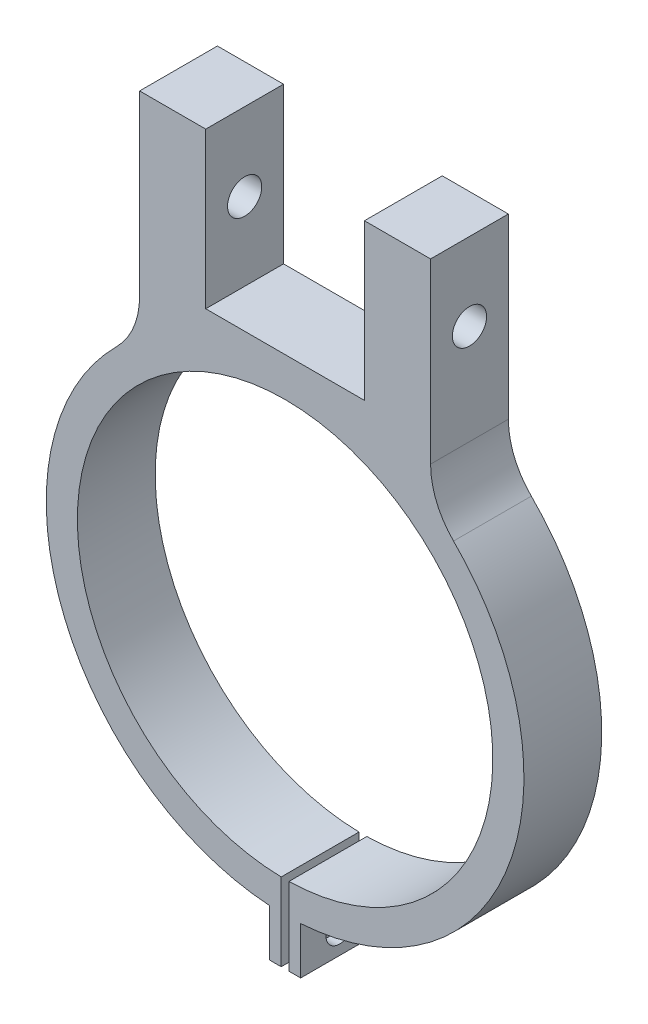
ISO-10303-21;
HEADER;
FILE_DESCRIPTION(('STEP AP214'),'2;1');
FILE_NAME('part.step','',(''),(''),'','','');
FILE_SCHEMA(('AUTOMOTIVE_DESIGN { 1 0 10303 214 1 1 1 1 }'));
ENDSEC;
DATA;
#1=APPLICATION_CONTEXT('core data for automotive mechanical design processes');
#2=APPLICATION_PROTOCOL_DEFINITION('international standard','automotive_design',2000,#1);
#3=PRODUCT_CONTEXT('',#1,'mechanical');
#4=PRODUCT('Part','Part','',(#3));
#5=PRODUCT_RELATED_PRODUCT_CATEGORY('part','',(#4));
#6=PRODUCT_DEFINITION_FORMATION('','',#4);
#7=PRODUCT_DEFINITION_CONTEXT('part definition',#1,'design');
#8=PRODUCT_DEFINITION('design','',#6,#7);
#9=PRODUCT_DEFINITION_SHAPE('','',#8);
#10=(LENGTH_UNIT() NAMED_UNIT(*) SI_UNIT(.MILLI.,.METRE.));
#11=(NAMED_UNIT(*) PLANE_ANGLE_UNIT() SI_UNIT($,.RADIAN.));
#12=(NAMED_UNIT(*) SI_UNIT($,.STERADIAN.) SOLID_ANGLE_UNIT());
#13=UNCERTAINTY_MEASURE_WITH_UNIT(LENGTH_MEASURE(1.E-05),#10,'distance_accuracy_value','');
#14=(GEOMETRIC_REPRESENTATION_CONTEXT(3) GLOBAL_UNCERTAINTY_ASSIGNED_CONTEXT((#13)) GLOBAL_UNIT_ASSIGNED_CONTEXT((#10,
#11,#12)) REPRESENTATION_CONTEXT('',''));
#15=CARTESIAN_POINT('',(0.,0.,0.));
#16=DIRECTION('',(0.,0.,1.));
#17=DIRECTION('',(1.,0.,0.));
#18=AXIS2_PLACEMENT_3D('',#15,#16,#17);
#19=CARTESIAN_POINT('',(2.,-36.6959280687195,10.));
#20=DIRECTION('',(-1.,0.,0.));
#21=DIRECTION('',(0.,-1.,0.));
#22=AXIS2_PLACEMENT_3D('',#19,#20,#21);
#23=PLANE('',#22);
#24=CARTESIAN_POINT('',(2.00000000000001,-33.6653561100363,5.));
#25=DIRECTION('',(-1.,0.,0.));
#26=DIRECTION('',(0.,-1.,0.));
#27=AXIS2_PLACEMENT_3D('',#24,#25,#26);
#28=CIRCLE('',#27,1.75);
#29=CARTESIAN_POINT('',(2.00000000000001,-35.4153561100363,5.));
#30=VERTEX_POINT('',#29);
#31=EDGE_CURVE('E227',#30,#30,#28,.T.);
#32=ORIENTED_EDGE('',*,*,#31,.T.);
#33=EDGE_LOOP('',(#32));
#34=FACE_BOUND('',#33,.T.);
#35=DIRECTION('',(0.,1.,0.));
#36=VECTOR('',#35,1.);
#37=CARTESIAN_POINT('',(2.,-36.6959280687195,0.));
#38=LINE('',#37,#36);
#39=CARTESIAN_POINT('',(2.,-36.6959280687195,0.));
#40=VERTEX_POINT('',#39);
#41=CARTESIAN_POINT('',(2.,-30.6347841513532,0.));
#42=VERTEX_POINT('',#41);
#43=EDGE_CURVE('E185',#40,#42,#38,.T.);
#44=ORIENTED_EDGE('',*,*,#43,.T.);
#45=DIRECTION('',(0.,0.,-1.));
#46=VECTOR('',#45,1.);
#47=CARTESIAN_POINT('',(2.,-30.6347841513532,10.));
#48=LINE('',#47,#46);
#49=CARTESIAN_POINT('',(2.,-30.6347841513532,10.));
#50=VERTEX_POINT('',#49);
#51=EDGE_CURVE('E166',#50,#42,#48,.T.);
#52=ORIENTED_EDGE('',*,*,#51,.F.);
#53=DIRECTION('',(0.,1.,0.));
#54=VECTOR('',#53,1.);
#55=CARTESIAN_POINT('',(2.,-36.6959280687195,10.));
#56=LINE('',#55,#54);
#57=CARTESIAN_POINT('',(2.,-36.6959280687195,10.));
#58=VERTEX_POINT('',#57);
#59=EDGE_CURVE('E173',#58,#50,#56,.T.);
#60=ORIENTED_EDGE('',*,*,#59,.F.);
#61=DIRECTION('',(0.,0.,-1.));
#62=VECTOR('',#61,1.);
#63=CARTESIAN_POINT('',(2.,-36.6959280687195,10.));
#64=LINE('',#63,#62);
#65=EDGE_CURVE('E257',#58,#40,#64,.T.);
#66=ORIENTED_EDGE('',*,*,#65,.T.);
#67=EDGE_LOOP('',(#44,#52,#60,#66));
#68=FACE_BOUND('',#67,.T.);
#69=ADVANCED_FACE('F36',(#34,#68),#23,.F.);
#70=CARTESIAN_POINT('',(0.,0.,10.));
#71=DIRECTION('',(0.,0.,-1.));
#72=DIRECTION('',(-1.,0.,0.));
#73=AXIS2_PLACEMENT_3D('',#70,#71,#72);
#74=CYLINDRICAL_SURFACE('',#73,30.7);
#75=CARTESIAN_POINT('',(0.,0.,0.));
#76=DIRECTION('',(0.,0.,1.));
#77=DIRECTION('',(1.,0.,0.));
#78=AXIS2_PLACEMENT_3D('',#75,#76,#77);
#79=CIRCLE('',#78,30.7);
#80=CARTESIAN_POINT('',(21.6484029484029,21.7677892718479,0.));
#81=VERTEX_POINT('',#80);
#82=EDGE_CURVE('E221',#42,#81,#79,.T.);
#83=ORIENTED_EDGE('',*,*,#82,.T.);
#84=DIRECTION('',(0.,0.,-1.));
#85=VECTOR('',#84,1.);
#86=CARTESIAN_POINT('',(21.6484029484029,21.7677892718479,10.));
#87=LINE('',#86,#85);
#88=CARTESIAN_POINT('',(21.6484029484029,21.7677892718479,10.));
#89=VERTEX_POINT('',#88);
#90=EDGE_CURVE('E169',#81,#89,#87,.F.);
#91=ORIENTED_EDGE('',*,*,#90,.T.);
#92=CARTESIAN_POINT('',(0.,0.,10.));
#93=DIRECTION('',(0.,0.,1.));
#94=DIRECTION('',(1.,0.,0.));
#95=AXIS2_PLACEMENT_3D('',#92,#93,#94);
#96=CIRCLE('',#95,30.7);
#97=EDGE_CURVE('E161',#50,#89,#96,.T.);
#98=ORIENTED_EDGE('',*,*,#97,.F.);
#99=ORIENTED_EDGE('',*,*,#51,.T.);
#100=EDGE_LOOP('',(#83,#91,#98,#99));
#101=FACE_BOUND('',#100,.T.);
#102=ADVANCED_FACE('F164',(#101),#74,.T.);
#103=CARTESIAN_POINT('',(18.7,51.7,10.));
#104=DIRECTION('',(-1.,0.,0.));
#105=DIRECTION('',(0.,0.,1.));
#106=AXIS2_PLACEMENT_3D('',#103,#104,#105);
#107=PLANE('',#106);
#108=CARTESIAN_POINT('',(18.7,41.7,5.));
#109=DIRECTION('',(-1.,0.,0.));
#110=DIRECTION('',(0.,0.,1.));
#111=AXIS2_PLACEMENT_3D('',#108,#109,#110);
#112=CIRCLE('',#111,2.2);
#113=CARTESIAN_POINT('',(18.7,41.7,7.2));
#114=VERTEX_POINT('',#113);
#115=EDGE_CURVE('E582',#114,#114,#112,.T.);
#116=ORIENTED_EDGE('',*,*,#115,.T.);
#117=EDGE_LOOP('',(#116));
#118=FACE_BOUND('',#117,.T.);
#119=DIRECTION('',(0.,1.,0.));
#120=VECTOR('',#119,1.);
#121=CARTESIAN_POINT('',(18.7,51.7,10.));
#122=LINE('',#121,#120);
#123=CARTESIAN_POINT('',(18.7,28.8582743766844,10.));
#124=VERTEX_POINT('',#123);
#125=CARTESIAN_POINT('',(18.7,51.7,10.));
#126=VERTEX_POINT('',#125);
#127=EDGE_CURVE('E172',#124,#126,#122,.T.);
#128=ORIENTED_EDGE('',*,*,#127,.F.);
#129=DIRECTION('',(0.,0.,1.));
#130=VECTOR('',#129,1.);
#131=CARTESIAN_POINT('',(18.7,28.8582743766844,0.));
#132=LINE('',#131,#130);
#133=CARTESIAN_POINT('',(18.7,28.8582743766844,0.));
#134=VERTEX_POINT('',#133);
#135=EDGE_CURVE('E186',#124,#134,#132,.F.);
#136=ORIENTED_EDGE('',*,*,#135,.T.);
#137=DIRECTION('',(0.,1.,0.));
#138=VECTOR('',#137,1.);
#139=CARTESIAN_POINT('',(18.7,51.7,0.));
#140=LINE('',#139,#138);
#141=CARTESIAN_POINT('',(18.7,51.7,0.));
#142=VERTEX_POINT('',#141);
#143=EDGE_CURVE('E223',#134,#142,#140,.T.);
#144=ORIENTED_EDGE('',*,*,#143,.T.);
#145=DIRECTION('',(0.,0.,-1.));
#146=VECTOR('',#145,1.);
#147=CARTESIAN_POINT('',(18.7,51.7,10.));
#148=LINE('',#147,#146);
#149=EDGE_CURVE('E187',#126,#142,#148,.T.);
#150=ORIENTED_EDGE('',*,*,#149,.F.);
#151=EDGE_LOOP('',(#128,#136,#144,#150));
#152=FACE_BOUND('',#151,.T.);
#153=ADVANCED_FACE('F214',(#118,#152),#107,.F.);
#154=CARTESIAN_POINT('',(10.2,51.7,10.));
#155=DIRECTION('',(0.,-1.,0.));
#156=DIRECTION('',(0.,0.,-1.));
#157=AXIS2_PLACEMENT_3D('',#154,#155,#156);
#158=PLANE('',#157);
#159=DIRECTION('',(-1.,0.,0.));
#160=VECTOR('',#159,1.);
#161=CARTESIAN_POINT('',(10.2,51.7,0.));
#162=LINE('',#161,#160);
#163=CARTESIAN_POINT('',(10.2,51.7,0.));
#164=VERTEX_POINT('',#163);
#165=EDGE_CURVE('E225',#142,#164,#162,.T.);
#166=ORIENTED_EDGE('',*,*,#165,.T.);
#167=DIRECTION('',(0.,0.,-1.));
#168=VECTOR('',#167,1.);
#169=CARTESIAN_POINT('',(10.2,51.7,10.));
#170=LINE('',#169,#168);
#171=CARTESIAN_POINT('',(10.2,51.7,10.));
#172=VERTEX_POINT('',#171);
#173=EDGE_CURVE('E192',#172,#164,#170,.T.);
#174=ORIENTED_EDGE('',*,*,#173,.F.);
#175=DIRECTION('',(-1.,0.,0.));
#176=VECTOR('',#175,1.);
#177=CARTESIAN_POINT('',(10.2,51.7,10.));
#178=LINE('',#177,#176);
#179=EDGE_CURVE('E217',#126,#172,#178,.T.);
#180=ORIENTED_EDGE('',*,*,#179,.F.);
#181=ORIENTED_EDGE('',*,*,#149,.T.);
#182=EDGE_LOOP('',(#166,#174,#180,#181));
#183=FACE_BOUND('',#182,.T.);
#184=ADVANCED_FACE('F501',(#183),#158,.F.);
#185=CARTESIAN_POINT('',(10.2,31.7,10.));
#186=DIRECTION('',(1.,0.,0.));
#187=DIRECTION('',(0.,0.,-1.));
#188=AXIS2_PLACEMENT_3D('',#185,#186,#187);
#189=PLANE('',#188);
#190=CARTESIAN_POINT('',(10.2,41.7,5.));
#191=DIRECTION('',(1.,0.,0.));
#192=DIRECTION('',(0.,0.,-1.));
#193=AXIS2_PLACEMENT_3D('',#190,#191,#192);
#194=CIRCLE('',#193,2.2);
#195=CARTESIAN_POINT('',(10.2,41.7,2.8));
#196=VERTEX_POINT('',#195);
#197=EDGE_CURVE('E585',#196,#196,#194,.T.);
#198=ORIENTED_EDGE('',*,*,#197,.T.);
#199=EDGE_LOOP('',(#198));
#200=FACE_BOUND('',#199,.T.);
#201=DIRECTION('',(0.,-1.,0.));
#202=VECTOR('',#201,1.);
#203=CARTESIAN_POINT('',(10.2,31.7,0.));
#204=LINE('',#203,#202);
#205=CARTESIAN_POINT('',(10.2,31.7,0.));
#206=VERTEX_POINT('',#205);
#207=EDGE_CURVE('E232',#164,#206,#204,.T.);
#208=ORIENTED_EDGE('',*,*,#207,.T.);
#209=DIRECTION('',(0.,0.,-1.));
#210=VECTOR('',#209,1.);
#211=CARTESIAN_POINT('',(10.2,31.7,10.));
#212=LINE('',#211,#210);
#213=CARTESIAN_POINT('',(10.2,31.7,10.));
#214=VERTEX_POINT('',#213);
#215=EDGE_CURVE('E286',#214,#206,#212,.T.);
#216=ORIENTED_EDGE('',*,*,#215,.F.);
#217=DIRECTION('',(0.,-1.,0.));
#218=VECTOR('',#217,1.);
#219=CARTESIAN_POINT('',(10.2,31.7,10.));
#220=LINE('',#219,#218);
#221=EDGE_CURVE('E295',#172,#214,#220,.T.);
#222=ORIENTED_EDGE('',*,*,#221,.F.);
#223=ORIENTED_EDGE('',*,*,#173,.T.);
#224=EDGE_LOOP('',(#208,#216,#222,#223));
#225=FACE_BOUND('',#224,.T.);
#226=ADVANCED_FACE('F293',(#200,#225),#189,.F.);
#227=CARTESIAN_POINT('',(-10.2,31.7,10.));
#228=DIRECTION('',(0.,-1.,0.));
#229=DIRECTION('',(0.,0.,-1.));
#230=AXIS2_PLACEMENT_3D('',#227,#228,#229);
#231=PLANE('',#230);
#232=DIRECTION('',(-1.,0.,0.));
#233=VECTOR('',#232,1.);
#234=CARTESIAN_POINT('',(-10.2,31.7,0.));
#235=LINE('',#234,#233);
#236=CARTESIAN_POINT('',(-10.2,31.7,0.));
#237=VERTEX_POINT('',#236);
#238=EDGE_CURVE('E234',#206,#237,#235,.T.);
#239=ORIENTED_EDGE('',*,*,#238,.T.);
#240=DIRECTION('',(0.,0.,-1.));
#241=VECTOR('',#240,1.);
#242=CARTESIAN_POINT('',(-10.2,31.7,10.));
#243=LINE('',#242,#241);
#244=CARTESIAN_POINT('',(-10.2,31.7,10.));
#245=VERTEX_POINT('',#244);
#246=EDGE_CURVE('E283',#245,#237,#243,.T.);
#247=ORIENTED_EDGE('',*,*,#246,.F.);
#248=DIRECTION('',(-1.,0.,0.));
#249=VECTOR('',#248,1.);
#250=CARTESIAN_POINT('',(-10.2,31.7,10.));
#251=LINE('',#250,#249);
#252=EDGE_CURVE('E311',#214,#245,#251,.T.);
#253=ORIENTED_EDGE('',*,*,#252,.F.);
#254=ORIENTED_EDGE('',*,*,#215,.T.);
#255=EDGE_LOOP('',(#239,#247,#253,#254));
#256=FACE_BOUND('',#255,.T.);
#257=ADVANCED_FACE('F302',(#256),#231,.F.);
#258=CARTESIAN_POINT('',(-10.2,31.7,10.));
#259=DIRECTION('',(-1.,0.,0.));
#260=DIRECTION('',(0.,0.,1.));
#261=AXIS2_PLACEMENT_3D('',#258,#259,#260);
#262=PLANE('',#261);
#263=CARTESIAN_POINT('',(-10.2,41.7,5.));
#264=DIRECTION('',(-1.,0.,0.));
#265=DIRECTION('',(0.,0.,1.));
#266=AXIS2_PLACEMENT_3D('',#263,#264,#265);
#267=CIRCLE('',#266,2.2);
#268=CARTESIAN_POINT('',(-10.2,41.7,7.2));
#269=VERTEX_POINT('',#268);
#270=EDGE_CURVE('E588',#269,#269,#267,.T.);
#271=ORIENTED_EDGE('',*,*,#270,.T.);
#272=EDGE_LOOP('',(#271));
#273=FACE_BOUND('',#272,.T.);
#274=DIRECTION('',(0.,1.,0.));
#275=VECTOR('',#274,1.);
#276=CARTESIAN_POINT('',(-10.2,31.7,0.));
#277=LINE('',#276,#275);
#278=CARTESIAN_POINT('',(-10.2,51.7,0.));
#279=VERTEX_POINT('',#278);
#280=EDGE_CURVE('E236',#237,#279,#277,.T.);
#281=ORIENTED_EDGE('',*,*,#280,.T.);
#282=DIRECTION('',(0.,0.,-1.));
#283=VECTOR('',#282,1.);
#284=CARTESIAN_POINT('',(-10.2,51.7,10.));
#285=LINE('',#284,#283);
#286=CARTESIAN_POINT('',(-10.2,51.7,10.));
#287=VERTEX_POINT('',#286);
#288=EDGE_CURVE('E280',#287,#279,#285,.T.);
#289=ORIENTED_EDGE('',*,*,#288,.F.);
#290=DIRECTION('',(0.,1.,0.));
#291=VECTOR('',#290,1.);
#292=CARTESIAN_POINT('',(-10.2,31.7,10.));
#293=LINE('',#292,#291);
#294=EDGE_CURVE('E308',#245,#287,#293,.T.);
#295=ORIENTED_EDGE('',*,*,#294,.F.);
#296=ORIENTED_EDGE('',*,*,#246,.T.);
#297=EDGE_LOOP('',(#281,#289,#295,#296));
#298=FACE_BOUND('',#297,.T.);
#299=ADVANCED_FACE('F306',(#273,#298),#262,.F.);
#300=CARTESIAN_POINT('',(-10.2,51.7,10.));
#301=DIRECTION('',(0.,-1.,0.));
#302=DIRECTION('',(0.,0.,-1.));
#303=AXIS2_PLACEMENT_3D('',#300,#301,#302);
#304=PLANE('',#303);
#305=DIRECTION('',(-1.,0.,0.));
#306=VECTOR('',#305,1.);
#307=CARTESIAN_POINT('',(-10.2,51.7,0.));
#308=LINE('',#307,#306);
#309=CARTESIAN_POINT('',(-18.7,51.7,0.));
#310=VERTEX_POINT('',#309);
#311=EDGE_CURVE('E238',#279,#310,#308,.T.);
#312=ORIENTED_EDGE('',*,*,#311,.T.);
#313=DIRECTION('',(0.,0.,-1.));
#314=VECTOR('',#313,1.);
#315=CARTESIAN_POINT('',(-18.7,51.7,10.));
#316=LINE('',#315,#314);
#317=CARTESIAN_POINT('',(-18.7,51.7,10.));
#318=VERTEX_POINT('',#317);
#319=EDGE_CURVE('E277',#318,#310,#316,.T.);
#320=ORIENTED_EDGE('',*,*,#319,.F.);
#321=DIRECTION('',(-1.,0.,0.));
#322=VECTOR('',#321,1.);
#323=CARTESIAN_POINT('',(-10.2,51.7,10.));
#324=LINE('',#323,#322);
#325=EDGE_CURVE('E310',#287,#318,#324,.T.);
#326=ORIENTED_EDGE('',*,*,#325,.F.);
#327=ORIENTED_EDGE('',*,*,#288,.T.);
#328=EDGE_LOOP('',(#312,#320,#326,#327));
#329=FACE_BOUND('',#328,.T.);
#330=ADVANCED_FACE('F366',(#329),#304,.F.);
#331=CARTESIAN_POINT('',(-18.7,51.7,10.));
#332=DIRECTION('',(1.,0.,0.));
#333=DIRECTION('',(0.,0.,-1.));
#334=AXIS2_PLACEMENT_3D('',#331,#332,#333);
#335=PLANE('',#334);
#336=CARTESIAN_POINT('',(-18.7,41.7,5.));
#337=DIRECTION('',(-1.,0.,0.));
#338=DIRECTION('',(0.,-1.,0.));
#339=AXIS2_PLACEMENT_3D('',#336,#337,#338);
#340=CIRCLE('',#339,2.2);
#341=CARTESIAN_POINT('',(-18.7,39.5,5.));
#342=VERTEX_POINT('',#341);
#343=EDGE_CURVE('E591',#342,#342,#340,.T.);
#344=ORIENTED_EDGE('',*,*,#343,.F.);
#345=EDGE_LOOP('',(#344));
#346=FACE_BOUND('',#345,.T.);
#347=DIRECTION('',(0.,-1.,0.));
#348=VECTOR('',#347,1.);
#349=CARTESIAN_POINT('',(-18.7,51.7,0.));
#350=LINE('',#349,#348);
#351=CARTESIAN_POINT('',(-18.7,28.8582743766844,0.));
#352=VERTEX_POINT('',#351);
#353=EDGE_CURVE('E240',#310,#352,#350,.T.);
#354=ORIENTED_EDGE('',*,*,#353,.T.);
#355=DIRECTION('',(0.,0.,1.));
#356=VECTOR('',#355,1.);
#357=CARTESIAN_POINT('',(-18.7,28.8582743766844,10.));
#358=LINE('',#357,#356);
#359=CARTESIAN_POINT('',(-18.7,28.8582743766844,10.));
#360=VERTEX_POINT('',#359);
#361=EDGE_CURVE('E51',#352,#360,#358,.T.);
#362=ORIENTED_EDGE('',*,*,#361,.T.);
#363=DIRECTION('',(0.,-1.,0.));
#364=VECTOR('',#363,1.);
#365=CARTESIAN_POINT('',(-18.7,51.7,10.));
#366=LINE('',#365,#364);
#367=EDGE_CURVE('E313',#318,#360,#366,.T.);
#368=ORIENTED_EDGE('',*,*,#367,.F.);
#369=ORIENTED_EDGE('',*,*,#319,.T.);
#370=EDGE_LOOP('',(#354,#362,#368,#369));
#371=FACE_BOUND('',#370,.T.);
#372=ADVANCED_FACE('F364',(#346,#371),#335,.F.);
#373=CARTESIAN_POINT('',(0.,0.,10.));
#374=DIRECTION('',(0.,0.,-1.));
#375=DIRECTION('',(-1.,0.,0.));
#376=AXIS2_PLACEMENT_3D('',#373,#374,#375);
#377=CYLINDRICAL_SURFACE('',#376,30.7);
#378=CARTESIAN_POINT('',(0.,0.,10.));
#379=DIRECTION('',(0.,0.,1.));
#380=DIRECTION('',(1.,0.,0.));
#381=AXIS2_PLACEMENT_3D('',#378,#379,#380);
#382=CIRCLE('',#381,30.7);
#383=CARTESIAN_POINT('',(-21.6484029484029,21.7677892718479,10.));
#384=VERTEX_POINT('',#383);
#385=CARTESIAN_POINT('',(-2.,-30.6347841513532,10.));
#386=VERTEX_POINT('',#385);
#387=EDGE_CURVE('E319',#384,#386,#382,.T.);
#388=ORIENTED_EDGE('',*,*,#387,.F.);
#389=DIRECTION('',(0.,0.,-1.));
#390=VECTOR('',#389,1.);
#391=CARTESIAN_POINT('',(-21.6484029484029,21.7677892718479,10.));
#392=LINE('',#391,#390);
#393=CARTESIAN_POINT('',(-21.6484029484029,21.7677892718479,0.));
#394=VERTEX_POINT('',#393);
#395=EDGE_CURVE('E202',#384,#394,#392,.T.);
#396=ORIENTED_EDGE('',*,*,#395,.T.);
#397=CARTESIAN_POINT('',(0.,0.,0.));
#398=DIRECTION('',(0.,0.,1.));
#399=DIRECTION('',(1.,0.,0.));
#400=AXIS2_PLACEMENT_3D('',#397,#398,#399);
#401=CIRCLE('',#400,30.7);
#402=CARTESIAN_POINT('',(-2.,-30.6347841513532,0.));
#403=VERTEX_POINT('',#402);
#404=EDGE_CURVE('E242',#394,#403,#401,.T.);
#405=ORIENTED_EDGE('',*,*,#404,.T.);
#406=DIRECTION('',(0.,0.,-1.));
#407=VECTOR('',#406,1.);
#408=CARTESIAN_POINT('',(-2.,-30.6347841513532,10.));
#409=LINE('',#408,#407);
#410=EDGE_CURVE('E274',#386,#403,#409,.T.);
#411=ORIENTED_EDGE('',*,*,#410,.F.);
#412=EDGE_LOOP('',(#388,#396,#405,#411));
#413=FACE_BOUND('',#412,.T.);
#414=ADVANCED_FACE('F359',(#413),#377,.T.);
#415=CARTESIAN_POINT('',(-2.,-36.6959280687195,10.));
#416=DIRECTION('',(1.,0.,0.));
#417=DIRECTION('',(0.,1.,0.));
#418=AXIS2_PLACEMENT_3D('',#415,#416,#417);
#419=PLANE('',#418);
#420=CARTESIAN_POINT('',(-2.,-33.6653561100363,5.));
#421=DIRECTION('',(-1.,0.,0.));
#422=DIRECTION('',(0.,0.,1.));
#423=AXIS2_PLACEMENT_3D('',#420,#421,#422);
#424=CIRCLE('',#423,1.75);
#425=CARTESIAN_POINT('',(-2.,-33.6653561100363,6.75));
#426=VERTEX_POINT('',#425);
#427=EDGE_CURVE('E199',#426,#426,#424,.T.);
#428=ORIENTED_EDGE('',*,*,#427,.F.);
#429=EDGE_LOOP('',(#428));
#430=FACE_BOUND('',#429,.T.);
#431=DIRECTION('',(0.,-1.,0.));
#432=VECTOR('',#431,1.);
#433=CARTESIAN_POINT('',(-2.,-36.6959280687195,0.));
#434=LINE('',#433,#432);
#435=CARTESIAN_POINT('',(-2.,-36.6959280687195,0.));
#436=VERTEX_POINT('',#435);
#437=EDGE_CURVE('E244',#403,#436,#434,.T.);
#438=ORIENTED_EDGE('',*,*,#437,.T.);
#439=DIRECTION('',(0.,0.,-1.));
#440=VECTOR('',#439,1.);
#441=CARTESIAN_POINT('',(-2.,-36.6959280687195,10.));
#442=LINE('',#441,#440);
#443=CARTESIAN_POINT('',(-2.,-36.6959280687195,10.));
#444=VERTEX_POINT('',#443);
#445=EDGE_CURVE('E271',#444,#436,#442,.T.);
#446=ORIENTED_EDGE('',*,*,#445,.F.);
#447=DIRECTION('',(0.,-1.,0.));
#448=VECTOR('',#447,1.);
#449=CARTESIAN_POINT('',(-2.,-36.6959280687195,10.));
#450=LINE('',#449,#448);
#451=EDGE_CURVE('E321',#386,#444,#450,.T.);
#452=ORIENTED_EDGE('',*,*,#451,.F.);
#453=ORIENTED_EDGE('',*,*,#410,.T.);
#454=EDGE_LOOP('',(#438,#446,#452,#453));
#455=FACE_BOUND('',#454,.T.);
#456=ADVANCED_FACE('F355',(#430,#455),#419,.F.);
#457=CARTESIAN_POINT('',(-0.499999999999996,-36.6959280687195,10.));
#458=DIRECTION('',(0.,1.,0.));
#459=DIRECTION('',(0.,0.,1.));
#460=AXIS2_PLACEMENT_3D('',#457,#458,#459);
#461=PLANE('',#460);
#462=DIRECTION('',(1.,0.,0.));
#463=VECTOR('',#462,1.);
#464=CARTESIAN_POINT('',(-0.499999999999996,-36.6959280687195,0.));
#465=LINE('',#464,#463);
#466=CARTESIAN_POINT('',(-0.499999999999996,-36.6959280687195,0.));
#467=VERTEX_POINT('',#466);
#468=EDGE_CURVE('E246',#436,#467,#465,.T.);
#469=ORIENTED_EDGE('',*,*,#468,.T.);
#470=DIRECTION('',(0.,0.,-1.));
#471=VECTOR('',#470,1.);
#472=CARTESIAN_POINT('',(-0.499999999999996,-36.6959280687195,10.));
#473=LINE('',#472,#471);
#474=CARTESIAN_POINT('',(-0.499999999999996,-36.6959280687195,10.));
#475=VERTEX_POINT('',#474);
#476=EDGE_CURVE('E268',#475,#467,#473,.T.);
#477=ORIENTED_EDGE('',*,*,#476,.F.);
#478=DIRECTION('',(1.,0.,0.));
#479=VECTOR('',#478,1.);
#480=CARTESIAN_POINT('',(-0.499999999999996,-36.6959280687195,10.));
#481=LINE('',#480,#479);
#482=EDGE_CURVE('E323',#444,#475,#481,.T.);
#483=ORIENTED_EDGE('',*,*,#482,.F.);
#484=ORIENTED_EDGE('',*,*,#445,.T.);
#485=EDGE_LOOP('',(#469,#477,#483,#484));
#486=FACE_BOUND('',#485,.T.);
#487=ADVANCED_FACE('F350',(#486),#461,.F.);
#488=CARTESIAN_POINT('',(-0.499999999999997,-26.6953179415417,10.));
#489=DIRECTION('',(-1.,0.,0.));
#490=DIRECTION('',(0.,-1.,0.));
#491=AXIS2_PLACEMENT_3D('',#488,#489,#490);
#492=PLANE('',#491);
#493=CARTESIAN_POINT('',(-0.499999999999997,-33.6653561100363,5.));
#494=DIRECTION('',(-1.,0.,0.));
#495=DIRECTION('',(0.,-1.,0.));
#496=AXIS2_PLACEMENT_3D('',#493,#494,#495);
#497=CIRCLE('',#496,1.75);
#498=CARTESIAN_POINT('',(-0.499999999999997,-35.4153561100363,5.));
#499=VERTEX_POINT('',#498);
#500=EDGE_CURVE('E198',#499,#499,#497,.T.);
#501=ORIENTED_EDGE('',*,*,#500,.T.);
#502=EDGE_LOOP('',(#501));
#503=FACE_BOUND('',#502,.T.);
#504=DIRECTION('',(0.,1.,0.));
#505=VECTOR('',#504,1.);
#506=CARTESIAN_POINT('',(-0.499999999999997,-26.6953179415417,0.));
#507=LINE('',#506,#505);
#508=CARTESIAN_POINT('',(-0.500000000000014,-26.6953179415417,0.));
#509=VERTEX_POINT('',#508);
#510=EDGE_CURVE('E249',#467,#509,#507,.T.);
#511=ORIENTED_EDGE('',*,*,#510,.T.);
#512=DIRECTION('',(0.,0.,-1.));
#513=VECTOR('',#512,1.);
#514=CARTESIAN_POINT('',(-0.500000000000014,-26.6953179415417,10.));
#515=LINE('',#514,#513);
#516=CARTESIAN_POINT('',(-0.500000000000014,-26.6953179415417,10.));
#517=VERTEX_POINT('',#516);
#518=EDGE_CURVE('E265',#517,#509,#515,.T.);
#519=ORIENTED_EDGE('',*,*,#518,.F.);
#520=DIRECTION('',(0.,1.,0.));
#521=VECTOR('',#520,1.);
#522=CARTESIAN_POINT('',(-0.499999999999996,-30.6959280687195,10.));
#523=LINE('',#522,#521);
#524=EDGE_CURVE('E325',#475,#517,#523,.T.);
#525=ORIENTED_EDGE('',*,*,#524,.F.);
#526=ORIENTED_EDGE('',*,*,#476,.T.);
#527=EDGE_LOOP('',(#511,#519,#525,#526));
#528=FACE_BOUND('',#527,.T.);
#529=ADVANCED_FACE('F345',(#503,#528),#492,.F.);
#530=CARTESIAN_POINT('',(0.,0.,10.));
#531=DIRECTION('',(0.,0.,-1.));
#532=DIRECTION('',(-1.,0.,0.));
#533=AXIS2_PLACEMENT_3D('',#530,#531,#532);
#534=CYLINDRICAL_SURFACE('',#533,26.7);
#535=CARTESIAN_POINT('',(0.,0.,0.));
#536=DIRECTION('',(0.,0.,-1.));
#537=DIRECTION('',(1.,0.,0.));
#538=AXIS2_PLACEMENT_3D('',#535,#536,#537);
#539=CIRCLE('',#538,26.7);
#540=CARTESIAN_POINT('',(0.500000000000003,-26.6953179415417,0.));
#541=VERTEX_POINT('',#540);
#542=EDGE_CURVE('E251',#509,#541,#539,.T.);
#543=ORIENTED_EDGE('',*,*,#542,.T.);
#544=DIRECTION('',(0.,0.,-1.));
#545=VECTOR('',#544,1.);
#546=CARTESIAN_POINT('',(0.500000000000003,-26.6953179415417,10.));
#547=LINE('',#546,#545);
#548=CARTESIAN_POINT('',(0.500000000000003,-26.6953179415417,10.));
#549=VERTEX_POINT('',#548);
#550=EDGE_CURVE('E262',#549,#541,#547,.T.);
#551=ORIENTED_EDGE('',*,*,#550,.F.);
#552=CARTESIAN_POINT('',(0.,0.,10.));
#553=DIRECTION('',(0.,0.,-1.));
#554=DIRECTION('',(1.,0.,0.));
#555=AXIS2_PLACEMENT_3D('',#552,#553,#554);
#556=CIRCLE('',#555,26.7);
#557=EDGE_CURVE('E327',#517,#549,#556,.T.);
#558=ORIENTED_EDGE('',*,*,#557,.F.);
#559=ORIENTED_EDGE('',*,*,#518,.T.);
#560=EDGE_LOOP('',(#543,#551,#558,#559));
#561=FACE_BOUND('',#560,.T.);
#562=ADVANCED_FACE('F341',(#561),#534,.F.);
#563=CARTESIAN_POINT('',(0.500000000000004,-30.6959280687195,10.));
#564=DIRECTION('',(1.,0.,0.));
#565=DIRECTION('',(0.,1.,0.));
#566=AXIS2_PLACEMENT_3D('',#563,#564,#565);
#567=PLANE('',#566);
#568=CARTESIAN_POINT('',(0.500000000000004,-33.6653561100363,5.));
#569=DIRECTION('',(1.,0.,0.));
#570=DIRECTION('',(0.,1.,0.));
#571=AXIS2_PLACEMENT_3D('',#568,#569,#570);
#572=CIRCLE('',#571,1.75);
#573=CARTESIAN_POINT('',(0.500000000000004,-31.9153561100363,5.));
#574=VERTEX_POINT('',#573);
#575=EDGE_CURVE('E196',#574,#574,#572,.T.);
#576=ORIENTED_EDGE('',*,*,#575,.T.);
#577=EDGE_LOOP('',(#576));
#578=FACE_BOUND('',#577,.T.);
#579=DIRECTION('',(0.,-1.,0.));
#580=VECTOR('',#579,1.);
#581=CARTESIAN_POINT('',(0.500000000000004,-30.6959280687195,0.));
#582=LINE('',#581,#580);
#583=CARTESIAN_POINT('',(0.500000000000005,-36.6959280687195,0.));
#584=VERTEX_POINT('',#583);
#585=EDGE_CURVE('E254',#541,#584,#582,.T.);
#586=ORIENTED_EDGE('',*,*,#585,.T.);
#587=DIRECTION('',(0.,0.,-1.));
#588=VECTOR('',#587,1.);
#589=CARTESIAN_POINT('',(0.500000000000005,-36.6959280687195,10.));
#590=LINE('',#589,#588);
#591=CARTESIAN_POINT('',(0.500000000000005,-36.6959280687195,10.));
#592=VERTEX_POINT('',#591);
#593=EDGE_CURVE('E259',#592,#584,#590,.T.);
#594=ORIENTED_EDGE('',*,*,#593,.F.);
#595=DIRECTION('',(0.,-1.,0.));
#596=VECTOR('',#595,1.);
#597=CARTESIAN_POINT('',(0.500000000000003,-26.6953179415417,10.));
#598=LINE('',#597,#596);
#599=EDGE_CURVE('E329',#549,#592,#598,.T.);
#600=ORIENTED_EDGE('',*,*,#599,.F.);
#601=ORIENTED_EDGE('',*,*,#550,.T.);
#602=EDGE_LOOP('',(#586,#594,#600,#601));
#603=FACE_BOUND('',#602,.T.);
#604=ADVANCED_FACE('F335',(#578,#603),#567,.F.);
#605=CARTESIAN_POINT('',(0.500000000000005,-36.6959280687195,10.));
#606=DIRECTION('',(0.,1.,0.));
#607=DIRECTION('',(0.,0.,1.));
#608=AXIS2_PLACEMENT_3D('',#605,#606,#607);
#609=PLANE('',#608);
#610=DIRECTION('',(1.,0.,0.));
#611=VECTOR('',#610,1.);
#612=CARTESIAN_POINT('',(0.500000000000005,-36.6959280687195,0.));
#613=LINE('',#612,#611);
#614=EDGE_CURVE('E182',#584,#40,#613,.T.);
#615=ORIENTED_EDGE('',*,*,#614,.T.);
#616=ORIENTED_EDGE('',*,*,#65,.F.);
#617=DIRECTION('',(1.,0.,0.));
#618=VECTOR('',#617,1.);
#619=CARTESIAN_POINT('',(0.500000000000005,-36.6959280687195,10.));
#620=LINE('',#619,#618);
#621=EDGE_CURVE('E178',#592,#58,#620,.T.);
#622=ORIENTED_EDGE('',*,*,#621,.F.);
#623=ORIENTED_EDGE('',*,*,#593,.T.);
#624=EDGE_LOOP('',(#615,#616,#622,#623));
#625=FACE_BOUND('',#624,.T.);
#626=ADVANCED_FACE('F338',(#625),#609,.F.);
#627=CARTESIAN_POINT('',(0.,0.,10.));
#628=DIRECTION('',(0.,0.,1.));
#629=DIRECTION('',(1.,0.,0.));
#630=AXIS2_PLACEMENT_3D('',#627,#628,#629);
#631=PLANE('',#630);
#632=ORIENTED_EDGE('',*,*,#59,.T.);
#633=ORIENTED_EDGE('',*,*,#97,.T.);
#634=CARTESIAN_POINT('',(28.7,28.8582743766844,10.));
#635=DIRECTION('',(0.,0.,1.));
#636=DIRECTION('',(1.,0.,0.));
#637=AXIS2_PLACEMENT_3D('',#634,#635,#636);
#638=CIRCLE('',#637,10.);
#639=EDGE_CURVE('E208',#89,#124,#638,.F.);
#640=ORIENTED_EDGE('',*,*,#639,.T.);
#641=ORIENTED_EDGE('',*,*,#127,.T.);
#642=ORIENTED_EDGE('',*,*,#179,.T.);
#643=ORIENTED_EDGE('',*,*,#221,.T.);
#644=ORIENTED_EDGE('',*,*,#252,.T.);
#645=ORIENTED_EDGE('',*,*,#294,.T.);
#646=ORIENTED_EDGE('',*,*,#325,.T.);
#647=ORIENTED_EDGE('',*,*,#367,.T.);
#648=CARTESIAN_POINT('',(-28.7,28.8582743766844,10.));
#649=DIRECTION('',(0.,0.,1.));
#650=DIRECTION('',(1.,0.,0.));
#651=AXIS2_PLACEMENT_3D('',#648,#649,#650);
#652=CIRCLE('',#651,10.);
#653=EDGE_CURVE('E11',#360,#384,#652,.F.);
#654=ORIENTED_EDGE('',*,*,#653,.T.);
#655=ORIENTED_EDGE('',*,*,#387,.T.);
#656=ORIENTED_EDGE('',*,*,#451,.T.);
#657=ORIENTED_EDGE('',*,*,#482,.T.);
#658=ORIENTED_EDGE('',*,*,#524,.T.);
#659=ORIENTED_EDGE('',*,*,#557,.T.);
#660=ORIENTED_EDGE('',*,*,#599,.T.);
#661=ORIENTED_EDGE('',*,*,#621,.T.);
#662=EDGE_LOOP('',(#632,#633,#640,#641,#642,#643,#644,#645,#646,#647,#654,#655,#656,#657,#658,
#659,#660,#661));
#663=FACE_BOUND('',#662,.T.);
#664=ADVANCED_FACE('F176',(#663),#631,.T.);
#665=CARTESIAN_POINT('',(0.,0.,0.));
#666=DIRECTION('',(0.,0.,1.));
#667=DIRECTION('',(1.,0.,0.));
#668=AXIS2_PLACEMENT_3D('',#665,#666,#667);
#669=PLANE('',#668);
#670=ORIENTED_EDGE('',*,*,#43,.F.);
#671=ORIENTED_EDGE('',*,*,#614,.F.);
#672=ORIENTED_EDGE('',*,*,#585,.F.);
#673=ORIENTED_EDGE('',*,*,#542,.F.);
#674=ORIENTED_EDGE('',*,*,#510,.F.);
#675=ORIENTED_EDGE('',*,*,#468,.F.);
#676=ORIENTED_EDGE('',*,*,#437,.F.);
#677=ORIENTED_EDGE('',*,*,#404,.F.);
#678=CARTESIAN_POINT('',(-28.7,28.8582743766844,0.));
#679=DIRECTION('',(0.,0.,1.));
#680=DIRECTION('',(1.,0.,0.));
#681=AXIS2_PLACEMENT_3D('',#678,#679,#680);
#682=CIRCLE('',#681,10.);
#683=EDGE_CURVE('E44',#394,#352,#682,.T.);
#684=ORIENTED_EDGE('',*,*,#683,.T.);
#685=ORIENTED_EDGE('',*,*,#353,.F.);
#686=ORIENTED_EDGE('',*,*,#311,.F.);
#687=ORIENTED_EDGE('',*,*,#280,.F.);
#688=ORIENTED_EDGE('',*,*,#238,.F.);
#689=ORIENTED_EDGE('',*,*,#207,.F.);
#690=ORIENTED_EDGE('',*,*,#165,.F.);
#691=ORIENTED_EDGE('',*,*,#143,.F.);
#692=CARTESIAN_POINT('',(28.7,28.8582743766844,0.));
#693=DIRECTION('',(0.,0.,1.));
#694=DIRECTION('',(1.,0.,0.));
#695=AXIS2_PLACEMENT_3D('',#692,#693,#694);
#696=CIRCLE('',#695,10.);
#697=EDGE_CURVE('E206',#134,#81,#696,.T.);
#698=ORIENTED_EDGE('',*,*,#697,.T.);
#699=ORIENTED_EDGE('',*,*,#82,.F.);
#700=EDGE_LOOP('',(#670,#671,#672,#673,#674,#675,#676,#677,#684,#685,#686,#687,#688,#689,#690,
#691,#698,#699));
#701=FACE_BOUND('',#700,.T.);
#702=ADVANCED_FACE('F220',(#701),#669,.F.);
#703=CARTESIAN_POINT('',(30.7,-33.6653561100363,5.));
#704=DIRECTION('',(-1.,0.,0.));
#705=DIRECTION('',(0.,0.,1.));
#706=AXIS2_PLACEMENT_3D('',#703,#704,#705);
#707=CYLINDRICAL_SURFACE('',#706,1.75);
#708=ORIENTED_EDGE('',*,*,#575,.F.);
#709=EDGE_LOOP('',(#708));
#710=FACE_BOUND('',#709,.T.);
#711=ORIENTED_EDGE('',*,*,#31,.F.);
#712=EDGE_LOOP('',(#711));
#713=FACE_BOUND('',#712,.T.);
#714=ADVANCED_FACE('F403',(#710,#713),#707,.F.);
#715=ORIENTED_EDGE('',*,*,#427,.T.);
#716=EDGE_LOOP('',(#715));
#717=FACE_BOUND('',#716,.T.);
#718=ORIENTED_EDGE('',*,*,#500,.F.);
#719=EDGE_LOOP('',(#718));
#720=FACE_BOUND('',#719,.T.);
#721=ADVANCED_FACE('F398',(#717,#720),#707,.F.);
#722=CARTESIAN_POINT('',(30.7,41.7,5.));
#723=DIRECTION('',(-1.,0.,0.));
#724=DIRECTION('',(0.,-1.,0.));
#725=AXIS2_PLACEMENT_3D('',#722,#723,#724);
#726=CYLINDRICAL_SURFACE('',#725,2.2);
#727=ORIENTED_EDGE('',*,*,#343,.T.);
#728=EDGE_LOOP('',(#727));
#729=FACE_BOUND('',#728,.T.);
#730=ORIENTED_EDGE('',*,*,#270,.F.);
#731=EDGE_LOOP('',(#730));
#732=FACE_BOUND('',#731,.T.);
#733=ADVANCED_FACE('F392',(#729,#732),#726,.F.);
#734=ORIENTED_EDGE('',*,*,#197,.F.);
#735=EDGE_LOOP('',(#734));
#736=FACE_BOUND('',#735,.T.);
#737=ORIENTED_EDGE('',*,*,#115,.F.);
#738=EDGE_LOOP('',(#737));
#739=FACE_BOUND('',#738,.T.);
#740=ADVANCED_FACE('F387',(#736,#739),#726,.F.);
#741=CARTESIAN_POINT('',(28.7,28.8582743766844,10.));
#742=DIRECTION('',(0.,0.,-1.));
#743=DIRECTION('',(-1.,0.,0.));
#744=AXIS2_PLACEMENT_3D('',#741,#742,#743);
#745=CYLINDRICAL_SURFACE('',#744,10.);
#746=ORIENTED_EDGE('',*,*,#639,.F.);
#747=ORIENTED_EDGE('',*,*,#90,.F.);
#748=ORIENTED_EDGE('',*,*,#697,.F.);
#749=ORIENTED_EDGE('',*,*,#135,.F.);
#750=EDGE_LOOP('',(#746,#747,#748,#749));
#751=FACE_BOUND('',#750,.T.);
#752=ADVANCED_FACE('F219',(#751),#745,.F.);
#753=CARTESIAN_POINT('',(-28.7,28.8582743766844,10.));
#754=DIRECTION('',(0.,0.,-1.));
#755=DIRECTION('',(-1.,0.,0.));
#756=AXIS2_PLACEMENT_3D('',#753,#754,#755);
#757=CYLINDRICAL_SURFACE('',#756,10.);
#758=ORIENTED_EDGE('',*,*,#653,.F.);
#759=ORIENTED_EDGE('',*,*,#361,.F.);
#760=ORIENTED_EDGE('',*,*,#683,.F.);
#761=ORIENTED_EDGE('',*,*,#395,.F.);
#762=EDGE_LOOP('',(#758,#759,#760,#761));
#763=FACE_BOUND('',#762,.T.);
#764=ADVANCED_FACE('F38',(#763),#757,.F.);
#765=CLOSED_SHELL('',(#69,#102,#153,#184,#226,#257,#299,#330,#372,#414,#456,#487,#529,#562,#604,
#626,#664,#702,#714,#721,#733,#740,#752,#764));
#766=MANIFOLD_SOLID_BREP('B2',#765);
#767=ADVANCED_BREP_SHAPE_REPRESENTATION('',(#18,#766),#14);
#768=SHAPE_DEFINITION_REPRESENTATION(#9,#767);
ENDSEC;
END-ISO-10303-21;
